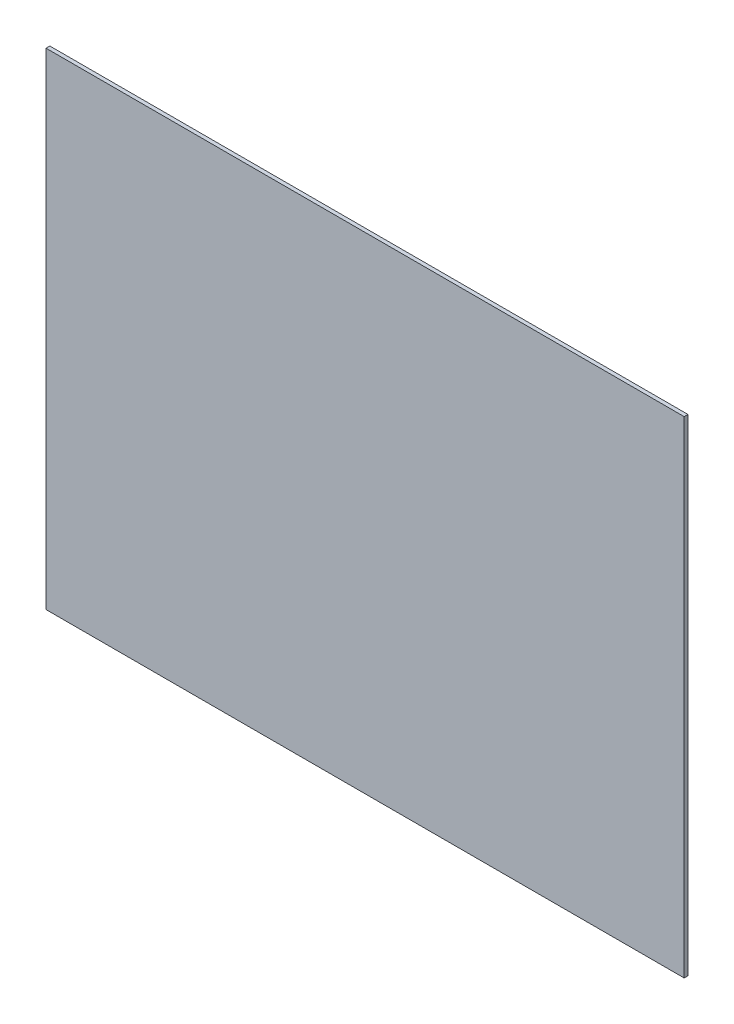
ISO-10303-21;
HEADER;
FILE_DESCRIPTION(('STEP AP214'),'2;1');
FILE_NAME('part.step','',(''),(''),'','','');
FILE_SCHEMA(('AUTOMOTIVE_DESIGN { 1 0 10303 214 1 1 1 1 }'));
ENDSEC;
DATA;
#1=APPLICATION_CONTEXT('core data for automotive mechanical design processes');
#2=APPLICATION_PROTOCOL_DEFINITION('international standard','automotive_design',2000,#1);
#3=PRODUCT_CONTEXT('',#1,'mechanical');
#4=PRODUCT('Part','Part','',(#3));
#5=PRODUCT_RELATED_PRODUCT_CATEGORY('part','',(#4));
#6=PRODUCT_DEFINITION_FORMATION('','',#4);
#7=PRODUCT_DEFINITION_CONTEXT('part definition',#1,'design');
#8=PRODUCT_DEFINITION('design','',#6,#7);
#9=PRODUCT_DEFINITION_SHAPE('','',#8);
#10=(LENGTH_UNIT() NAMED_UNIT(*) SI_UNIT(.MILLI.,.METRE.));
#11=(NAMED_UNIT(*) PLANE_ANGLE_UNIT() SI_UNIT($,.RADIAN.));
#12=(NAMED_UNIT(*) SI_UNIT($,.STERADIAN.) SOLID_ANGLE_UNIT());
#13=UNCERTAINTY_MEASURE_WITH_UNIT(LENGTH_MEASURE(1.E-05),#10,'distance_accuracy_value','');
#14=(GEOMETRIC_REPRESENTATION_CONTEXT(3) GLOBAL_UNCERTAINTY_ASSIGNED_CONTEXT((#13)) GLOBAL_UNIT_ASSIGNED_CONTEXT((#10,
#11,#12)) REPRESENTATION_CONTEXT('',''));
#15=CARTESIAN_POINT('',(0.,0.,0.));
#16=DIRECTION('',(0.,0.,1.));
#17=DIRECTION('',(1.,0.,0.));
#18=AXIS2_PLACEMENT_3D('',#15,#16,#17);
#19=CARTESIAN_POINT('',(400.05,-304.8,4.7625));
#20=DIRECTION('',(-1.,0.,0.));
#21=DIRECTION('',(0.,0.,1.));
#22=AXIS2_PLACEMENT_3D('',#19,#20,#21);
#23=PLANE('',#22);
#24=DIRECTION('',(0.,1.,0.));
#25=VECTOR('',#24,1.);
#26=CARTESIAN_POINT('',(400.05,-304.8,0.));
#27=LINE('',#26,#25);
#28=CARTESIAN_POINT('',(400.05,-304.8,0.));
#29=VERTEX_POINT('',#28);
#30=CARTESIAN_POINT('',(400.05,304.8,0.));
#31=VERTEX_POINT('',#30);
#32=EDGE_CURVE('E96',#29,#31,#27,.T.);
#33=ORIENTED_EDGE('',*,*,#32,.T.);
#34=DIRECTION('',(0.,0.,-1.));
#35=VECTOR('',#34,1.);
#36=CARTESIAN_POINT('',(400.05,304.8,4.7625));
#37=LINE('',#36,#35);
#38=CARTESIAN_POINT('',(400.05,304.8,4.7625));
#39=VERTEX_POINT('',#38);
#40=EDGE_CURVE('E11',#39,#31,#37,.T.);
#41=ORIENTED_EDGE('',*,*,#40,.F.);
#42=DIRECTION('',(0.,1.,0.));
#43=VECTOR('',#42,1.);
#44=CARTESIAN_POINT('',(400.05,-304.8,4.7625));
#45=LINE('',#44,#43);
#46=CARTESIAN_POINT('',(400.05,-304.8,4.7625));
#47=VERTEX_POINT('',#46);
#48=EDGE_CURVE('E84',#47,#39,#45,.T.);
#49=ORIENTED_EDGE('',*,*,#48,.F.);
#50=DIRECTION('',(0.,0.,-1.));
#51=VECTOR('',#50,1.);
#52=CARTESIAN_POINT('',(400.05,-304.8,4.7625));
#53=LINE('',#52,#51);
#54=EDGE_CURVE('E92',#47,#29,#53,.T.);
#55=ORIENTED_EDGE('',*,*,#54,.T.);
#56=EDGE_LOOP('',(#33,#41,#49,#55));
#57=FACE_BOUND('',#56,.T.);
#58=ADVANCED_FACE('F33',(#57),#23,.F.);
#59=CARTESIAN_POINT('',(-400.05,304.8,4.7625));
#60=DIRECTION('',(0.,-1.,0.));
#61=DIRECTION('',(0.,0.,-1.));
#62=AXIS2_PLACEMENT_3D('',#59,#60,#61);
#63=PLANE('',#62);
#64=DIRECTION('',(-1.,0.,0.));
#65=VECTOR('',#64,1.);
#66=CARTESIAN_POINT('',(-400.05,304.8,0.));
#67=LINE('',#66,#65);
#68=CARTESIAN_POINT('',(-400.05,304.8,0.));
#69=VERTEX_POINT('',#68);
#70=EDGE_CURVE('E88',#31,#69,#67,.T.);
#71=ORIENTED_EDGE('',*,*,#70,.T.);
#72=DIRECTION('',(0.,0.,-1.));
#73=VECTOR('',#72,1.);
#74=CARTESIAN_POINT('',(-400.05,304.8,4.7625));
#75=LINE('',#74,#73);
#76=CARTESIAN_POINT('',(-400.05,304.8,4.7625));
#77=VERTEX_POINT('',#76);
#78=EDGE_CURVE('E41',#77,#69,#75,.T.);
#79=ORIENTED_EDGE('',*,*,#78,.F.);
#80=DIRECTION('',(-1.,0.,0.));
#81=VECTOR('',#80,1.);
#82=CARTESIAN_POINT('',(-400.05,304.8,4.7625));
#83=LINE('',#82,#81);
#84=EDGE_CURVE('E79',#39,#77,#83,.T.);
#85=ORIENTED_EDGE('',*,*,#84,.F.);
#86=ORIENTED_EDGE('',*,*,#40,.T.);
#87=EDGE_LOOP('',(#71,#79,#85,#86));
#88=FACE_BOUND('',#87,.T.);
#89=ADVANCED_FACE('F87',(#88),#63,.F.);
#90=CARTESIAN_POINT('',(-400.05,-304.8,4.7625));
#91=DIRECTION('',(1.,0.,0.));
#92=DIRECTION('',(0.,0.,-1.));
#93=AXIS2_PLACEMENT_3D('',#90,#91,#92);
#94=PLANE('',#93);
#95=DIRECTION('',(0.,-1.,0.));
#96=VECTOR('',#95,1.);
#97=CARTESIAN_POINT('',(-400.05,-304.8,0.));
#98=LINE('',#97,#96);
#99=CARTESIAN_POINT('',(-400.05,-304.8,0.));
#100=VERTEX_POINT('',#99);
#101=EDGE_CURVE('E66',#69,#100,#98,.T.);
#102=ORIENTED_EDGE('',*,*,#101,.T.);
#103=DIRECTION('',(0.,0.,-1.));
#104=VECTOR('',#103,1.);
#105=CARTESIAN_POINT('',(-400.05,-304.8,4.7625));
#106=LINE('',#105,#104);
#107=CARTESIAN_POINT('',(-400.05,-304.8,4.7625));
#108=VERTEX_POINT('',#107);
#109=EDGE_CURVE('E89',#108,#100,#106,.T.);
#110=ORIENTED_EDGE('',*,*,#109,.F.);
#111=DIRECTION('',(0.,-1.,0.));
#112=VECTOR('',#111,1.);
#113=CARTESIAN_POINT('',(-400.05,-304.8,4.7625));
#114=LINE('',#113,#112);
#115=EDGE_CURVE('E82',#77,#108,#114,.T.);
#116=ORIENTED_EDGE('',*,*,#115,.F.);
#117=ORIENTED_EDGE('',*,*,#78,.T.);
#118=EDGE_LOOP('',(#102,#110,#116,#117));
#119=FACE_BOUND('',#118,.T.);
#120=ADVANCED_FACE('F90',(#119),#94,.F.);
#121=CARTESIAN_POINT('',(-400.05,-304.8,4.7625));
#122=DIRECTION('',(0.,1.,0.));
#123=DIRECTION('',(0.,0.,1.));
#124=AXIS2_PLACEMENT_3D('',#121,#122,#123);
#125=PLANE('',#124);
#126=DIRECTION('',(1.,0.,0.));
#127=VECTOR('',#126,1.);
#128=CARTESIAN_POINT('',(-400.05,-304.8,0.));
#129=LINE('',#128,#127);
#130=EDGE_CURVE('E72',#100,#29,#129,.T.);
#131=ORIENTED_EDGE('',*,*,#130,.T.);
#132=ORIENTED_EDGE('',*,*,#54,.F.);
#133=DIRECTION('',(1.,0.,0.));
#134=VECTOR('',#133,1.);
#135=CARTESIAN_POINT('',(-400.05,-304.8,4.7625));
#136=LINE('',#135,#134);
#137=EDGE_CURVE('E49',#108,#47,#136,.T.);
#138=ORIENTED_EDGE('',*,*,#137,.F.);
#139=ORIENTED_EDGE('',*,*,#109,.T.);
#140=EDGE_LOOP('',(#131,#132,#138,#139));
#141=FACE_BOUND('',#140,.T.);
#142=ADVANCED_FACE('F103',(#141),#125,.F.);
#143=CARTESIAN_POINT('',(0.,0.,4.7625));
#144=DIRECTION('',(0.,0.,-1.));
#145=DIRECTION('',(-1.,0.,0.));
#146=AXIS2_PLACEMENT_3D('',#143,#144,#145);
#147=PLANE('',#146);
#148=ORIENTED_EDGE('',*,*,#48,.T.);
#149=ORIENTED_EDGE('',*,*,#84,.T.);
#150=ORIENTED_EDGE('',*,*,#115,.T.);
#151=ORIENTED_EDGE('',*,*,#137,.T.);
#152=EDGE_LOOP('',(#148,#149,#150,#151));
#153=FACE_BOUND('',#152,.T.);
#154=ADVANCED_FACE('F80',(#153),#147,.F.);
#155=CARTESIAN_POINT('',(0.,0.,0.));
#156=DIRECTION('',(0.,0.,-1.));
#157=DIRECTION('',(-1.,0.,0.));
#158=AXIS2_PLACEMENT_3D('',#155,#156,#157);
#159=PLANE('',#158);
#160=ORIENTED_EDGE('',*,*,#32,.F.);
#161=ORIENTED_EDGE('',*,*,#130,.F.);
#162=ORIENTED_EDGE('',*,*,#101,.F.);
#163=ORIENTED_EDGE('',*,*,#70,.F.);
#164=EDGE_LOOP('',(#160,#161,#162,#163));
#165=FACE_BOUND('',#164,.T.);
#166=ADVANCED_FACE('F106',(#165),#159,.T.);
#167=CLOSED_SHELL('',(#58,#89,#120,#142,#154,#166));
#168=MANIFOLD_SOLID_BREP('B2',#167);
#169=ADVANCED_BREP_SHAPE_REPRESENTATION('',(#18,#168),#14);
#170=SHAPE_DEFINITION_REPRESENTATION(#9,#169);
ENDSEC;
END-ISO-10303-21;
